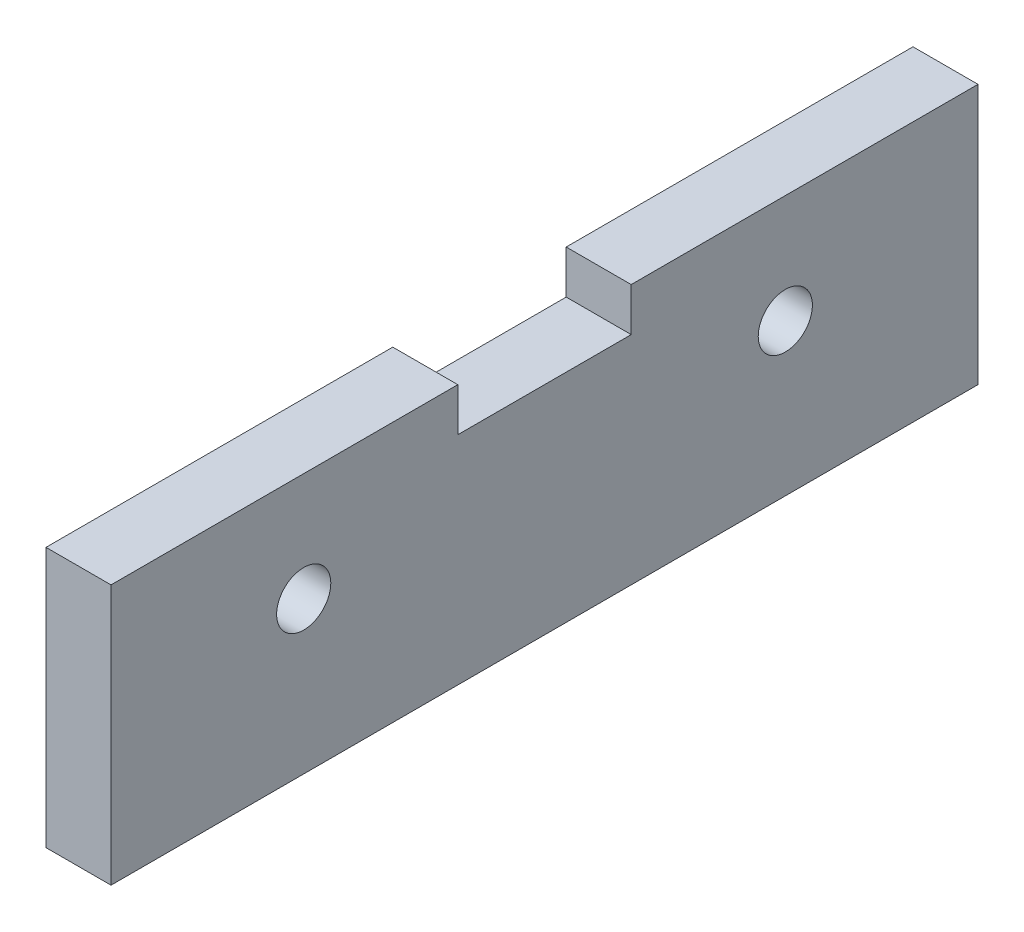
ISO-10303-21;
HEADER;
FILE_DESCRIPTION(('STEP AP214'),'2;1');
FILE_NAME('part.step','',(''),(''),'','','');
FILE_SCHEMA(('AUTOMOTIVE_DESIGN { 1 0 10303 214 1 1 1 1 }'));
ENDSEC;
DATA;
#1=APPLICATION_CONTEXT('core data for automotive mechanical design processes');
#2=APPLICATION_PROTOCOL_DEFINITION('international standard','automotive_design',2000,#1);
#3=PRODUCT_CONTEXT('',#1,'mechanical');
#4=PRODUCT('Part','Part','',(#3));
#5=PRODUCT_RELATED_PRODUCT_CATEGORY('part','',(#4));
#6=PRODUCT_DEFINITION_FORMATION('','',#4);
#7=PRODUCT_DEFINITION_CONTEXT('part definition',#1,'design');
#8=PRODUCT_DEFINITION('design','',#6,#7);
#9=PRODUCT_DEFINITION_SHAPE('','',#8);
#10=(LENGTH_UNIT() NAMED_UNIT(*) SI_UNIT(.MILLI.,.METRE.));
#11=(NAMED_UNIT(*) PLANE_ANGLE_UNIT() SI_UNIT($,.RADIAN.));
#12=(NAMED_UNIT(*) SI_UNIT($,.STERADIAN.) SOLID_ANGLE_UNIT());
#13=UNCERTAINTY_MEASURE_WITH_UNIT(LENGTH_MEASURE(1.E-05),#10,'distance_accuracy_value','');
#14=(GEOMETRIC_REPRESENTATION_CONTEXT(3) GLOBAL_UNCERTAINTY_ASSIGNED_CONTEXT((#13)) GLOBAL_UNIT_ASSIGNED_CONTEXT((#10,
#11,#12)) REPRESENTATION_CONTEXT('',''));
#15=CARTESIAN_POINT('',(0.,0.,0.));
#16=DIRECTION('',(0.,0.,1.));
#17=DIRECTION('',(1.,0.,0.));
#18=AXIS2_PLACEMENT_3D('',#15,#16,#17);
#19=CARTESIAN_POINT('',(3.,0.,0.));
#20=DIRECTION('',(1.,0.,0.));
#21=DIRECTION('',(0.,0.,-1.));
#22=AXIS2_PLACEMENT_3D('',#19,#20,#21);
#23=PLANE('',#22);
#24=DIRECTION('',(0.,-1.,0.));
#25=VECTOR('',#24,1.);
#26=CARTESIAN_POINT('',(3.,6.,4.));
#27=LINE('',#26,#25);
#28=CARTESIAN_POINT('',(3.,6.,4.));
#29=VERTEX_POINT('',#28);
#30=CARTESIAN_POINT('',(3.,4.,4.));
#31=VERTEX_POINT('',#30);
#32=EDGE_CURVE('E128',#29,#31,#27,.T.);
#33=ORIENTED_EDGE('',*,*,#32,.F.);
#34=DIRECTION('',(0.,0.,1.));
#35=VECTOR('',#34,1.);
#36=CARTESIAN_POINT('',(3.,6.,-20.));
#37=LINE('',#36,#35);
#38=CARTESIAN_POINT('',(3.,6.,20.));
#39=VERTEX_POINT('',#38);
#40=EDGE_CURVE('E66',#29,#39,#37,.T.);
#41=ORIENTED_EDGE('',*,*,#40,.T.);
#42=DIRECTION('',(0.,-1.,0.));
#43=VECTOR('',#42,1.);
#44=CARTESIAN_POINT('',(3.,-6.,20.));
#45=LINE('',#44,#43);
#46=CARTESIAN_POINT('',(3.,-6.,20.));
#47=VERTEX_POINT('',#46);
#48=EDGE_CURVE('E150',#39,#47,#45,.T.);
#49=ORIENTED_EDGE('',*,*,#48,.T.);
#50=DIRECTION('',(0.,0.,-1.));
#51=VECTOR('',#50,1.);
#52=CARTESIAN_POINT('',(3.,-6.,-20.));
#53=LINE('',#52,#51);
#54=CARTESIAN_POINT('',(3.,-6.,-20.));
#55=VERTEX_POINT('',#54);
#56=EDGE_CURVE('E96',#47,#55,#53,.T.);
#57=ORIENTED_EDGE('',*,*,#56,.T.);
#58=DIRECTION('',(0.,1.,0.));
#59=VECTOR('',#58,1.);
#60=CARTESIAN_POINT('',(3.,-6.,-20.));
#61=LINE('',#60,#59);
#62=CARTESIAN_POINT('',(3.,6.,-20.));
#63=VERTEX_POINT('',#62);
#64=EDGE_CURVE('E156',#55,#63,#61,.T.);
#65=ORIENTED_EDGE('',*,*,#64,.T.);
#66=CARTESIAN_POINT('',(3.,6.,-4.));
#67=VERTEX_POINT('',#66);
#68=EDGE_CURVE('E159',#63,#67,#37,.T.);
#69=ORIENTED_EDGE('',*,*,#68,.T.);
#70=DIRECTION('',(0.,1.,0.));
#71=VECTOR('',#70,1.);
#72=CARTESIAN_POINT('',(3.,6.,-4.));
#73=LINE('',#72,#71);
#74=CARTESIAN_POINT('',(3.,4.,-4.));
#75=VERTEX_POINT('',#74);
#76=EDGE_CURVE('E126',#75,#67,#73,.T.);
#77=ORIENTED_EDGE('',*,*,#76,.F.);
#78=DIRECTION('',(0.,0.,-1.));
#79=VECTOR('',#78,1.);
#80=CARTESIAN_POINT('',(3.,4.,4.));
#81=LINE('',#80,#79);
#82=EDGE_CURVE('E120',#31,#75,#81,.T.);
#83=ORIENTED_EDGE('',*,*,#82,.F.);
#84=EDGE_LOOP('',(#33,#41,#49,#57,#65,#69,#77,#83));
#85=FACE_BOUND('',#84,.T.);
#86=CARTESIAN_POINT('',(3.,0.999999999999997,11.11));
#87=DIRECTION('',(1.,0.,0.));
#88=DIRECTION('',(0.,0.,-1.));
#89=AXIS2_PLACEMENT_3D('',#86,#87,#88);
#90=CIRCLE('',#89,1.25);
#91=CARTESIAN_POINT('',(3.,0.999999999999997,9.86));
#92=VERTEX_POINT('',#91);
#93=EDGE_CURVE('E143',#92,#92,#90,.T.);
#94=ORIENTED_EDGE('',*,*,#93,.F.);
#95=EDGE_LOOP('',(#94));
#96=FACE_BOUND('',#95,.T.);
#97=CARTESIAN_POINT('',(3.,0.999999999999997,-11.11));
#98=DIRECTION('',(-1.,0.,0.));
#99=DIRECTION('',(0.,0.,1.));
#100=AXIS2_PLACEMENT_3D('',#97,#98,#99);
#101=CIRCLE('',#100,1.25);
#102=CARTESIAN_POINT('',(3.,0.999999999999997,-9.86));
#103=VERTEX_POINT('',#102);
#104=EDGE_CURVE('E203',#103,#103,#101,.T.);
#105=ORIENTED_EDGE('',*,*,#104,.T.);
#106=EDGE_LOOP('',(#105));
#107=FACE_BOUND('',#106,.T.);
#108=ADVANCED_FACE('F39',(#85,#96,#107),#23,.T.);
#109=CARTESIAN_POINT('',(0.,0.,0.));
#110=DIRECTION('',(1.,0.,0.));
#111=DIRECTION('',(0.,0.,-1.));
#112=AXIS2_PLACEMENT_3D('',#109,#110,#111);
#113=PLANE('',#112);
#114=CARTESIAN_POINT('',(0.,0.999999999999997,11.11));
#115=DIRECTION('',(1.,0.,0.));
#116=DIRECTION('',(0.,0.,-1.));
#117=AXIS2_PLACEMENT_3D('',#114,#115,#116);
#118=CIRCLE('',#117,1.25);
#119=CARTESIAN_POINT('',(0.,0.999999999999997,9.86));
#120=VERTEX_POINT('',#119);
#121=EDGE_CURVE('E168',#120,#120,#118,.T.);
#122=ORIENTED_EDGE('',*,*,#121,.T.);
#123=EDGE_LOOP('',(#122));
#124=FACE_BOUND('',#123,.T.);
#125=DIRECTION('',(0.,0.,1.));
#126=VECTOR('',#125,1.);
#127=CARTESIAN_POINT('',(0.,6.,-20.));
#128=LINE('',#127,#126);
#129=CARTESIAN_POINT('',(0.,6.,4.));
#130=VERTEX_POINT('',#129);
#131=CARTESIAN_POINT('',(0.,6.,20.));
#132=VERTEX_POINT('',#131);
#133=EDGE_CURVE('E88',#130,#132,#128,.T.);
#134=ORIENTED_EDGE('',*,*,#133,.F.);
#135=DIRECTION('',(0.,-1.,0.));
#136=VECTOR('',#135,1.);
#137=CARTESIAN_POINT('',(0.,0.,4.));
#138=LINE('',#137,#136);
#139=CARTESIAN_POINT('',(0.,4.,4.));
#140=VERTEX_POINT('',#139);
#141=EDGE_CURVE('E11',#130,#140,#138,.T.);
#142=ORIENTED_EDGE('',*,*,#141,.T.);
#143=DIRECTION('',(0.,0.,-1.));
#144=VECTOR('',#143,1.);
#145=CARTESIAN_POINT('',(0.,4.,0.));
#146=LINE('',#145,#144);
#147=CARTESIAN_POINT('',(0.,4.,-4.));
#148=VERTEX_POINT('',#147);
#149=EDGE_CURVE('E123',#140,#148,#146,.T.);
#150=ORIENTED_EDGE('',*,*,#149,.T.);
#151=DIRECTION('',(0.,1.,0.));
#152=VECTOR('',#151,1.);
#153=CARTESIAN_POINT('',(0.,0.,-4.));
#154=LINE('',#153,#152);
#155=CARTESIAN_POINT('',(0.,6.,-4.));
#156=VERTEX_POINT('',#155);
#157=EDGE_CURVE('E49',#148,#156,#154,.T.);
#158=ORIENTED_EDGE('',*,*,#157,.T.);
#159=CARTESIAN_POINT('',(0.,6.,-20.));
#160=VERTEX_POINT('',#159);
#161=EDGE_CURVE('E153',#160,#156,#128,.T.);
#162=ORIENTED_EDGE('',*,*,#161,.F.);
#163=DIRECTION('',(0.,1.,0.));
#164=VECTOR('',#163,1.);
#165=CARTESIAN_POINT('',(0.,-6.,-20.));
#166=LINE('',#165,#164);
#167=CARTESIAN_POINT('',(0.,-6.,-20.));
#168=VERTEX_POINT('',#167);
#169=EDGE_CURVE('E171',#168,#160,#166,.T.);
#170=ORIENTED_EDGE('',*,*,#169,.F.);
#171=DIRECTION('',(0.,0.,-1.));
#172=VECTOR('',#171,1.);
#173=CARTESIAN_POINT('',(0.,-6.,-20.));
#174=LINE('',#173,#172);
#175=CARTESIAN_POINT('',(0.,-6.,20.));
#176=VERTEX_POINT('',#175);
#177=EDGE_CURVE('E167',#176,#168,#174,.T.);
#178=ORIENTED_EDGE('',*,*,#177,.F.);
#179=DIRECTION('',(0.,-1.,0.));
#180=VECTOR('',#179,1.);
#181=CARTESIAN_POINT('',(0.,-6.,20.));
#182=LINE('',#181,#180);
#183=EDGE_CURVE('E163',#132,#176,#182,.T.);
#184=ORIENTED_EDGE('',*,*,#183,.F.);
#185=EDGE_LOOP('',(#134,#142,#150,#158,#162,#170,#178,#184));
#186=FACE_BOUND('',#185,.T.);
#187=CARTESIAN_POINT('',(0.,0.999999999999997,-11.11));
#188=DIRECTION('',(1.,0.,0.));
#189=DIRECTION('',(0.,0.,-1.));
#190=AXIS2_PLACEMENT_3D('',#187,#188,#189);
#191=CIRCLE('',#190,1.25);
#192=CARTESIAN_POINT('',(0.,0.999999999999997,-12.36));
#193=VERTEX_POINT('',#192);
#194=EDGE_CURVE('E43',#193,#193,#191,.F.);
#195=ORIENTED_EDGE('',*,*,#194,.F.);
#196=EDGE_LOOP('',(#195));
#197=FACE_BOUND('',#196,.T.);
#198=ADVANCED_FACE('F214',(#124,#186,#197),#113,.F.);
#199=CARTESIAN_POINT('',(3.,6.,-20.));
#200=DIRECTION('',(0.,-1.,0.));
#201=DIRECTION('',(0.,0.,-1.));
#202=AXIS2_PLACEMENT_3D('',#199,#200,#201);
#203=PLANE('',#202);
#204=ORIENTED_EDGE('',*,*,#40,.F.);
#205=DIRECTION('',(1.,0.,0.));
#206=VECTOR('',#205,1.);
#207=CARTESIAN_POINT('',(-2.,6.,4.));
#208=LINE('',#207,#206);
#209=EDGE_CURVE('E130',#130,#29,#208,.T.);
#210=ORIENTED_EDGE('',*,*,#209,.F.);
#211=ORIENTED_EDGE('',*,*,#133,.T.);
#212=DIRECTION('',(-1.,0.,0.));
#213=VECTOR('',#212,1.);
#214=CARTESIAN_POINT('',(3.,6.,20.));
#215=LINE('',#214,#213);
#216=EDGE_CURVE('E162',#39,#132,#215,.T.);
#217=ORIENTED_EDGE('',*,*,#216,.F.);
#218=EDGE_LOOP('',(#204,#210,#211,#217));
#219=FACE_BOUND('',#218,.T.);
#220=ADVANCED_FACE('F216',(#219),#203,.F.);
#221=CARTESIAN_POINT('',(3.,-6.,20.));
#222=DIRECTION('',(0.,0.,-1.));
#223=DIRECTION('',(-1.,0.,0.));
#224=AXIS2_PLACEMENT_3D('',#221,#222,#223);
#225=PLANE('',#224);
#226=ORIENTED_EDGE('',*,*,#183,.T.);
#227=DIRECTION('',(-1.,0.,0.));
#228=VECTOR('',#227,1.);
#229=CARTESIAN_POINT('',(3.,-6.,20.));
#230=LINE('',#229,#228);
#231=EDGE_CURVE('E187',#47,#176,#230,.T.);
#232=ORIENTED_EDGE('',*,*,#231,.F.);
#233=ORIENTED_EDGE('',*,*,#48,.F.);
#234=ORIENTED_EDGE('',*,*,#216,.T.);
#235=EDGE_LOOP('',(#226,#232,#233,#234));
#236=FACE_BOUND('',#235,.T.);
#237=ADVANCED_FACE('F41',(#236),#225,.F.);
#238=CARTESIAN_POINT('',(3.,-6.,-20.));
#239=DIRECTION('',(0.,1.,0.));
#240=DIRECTION('',(0.,0.,1.));
#241=AXIS2_PLACEMENT_3D('',#238,#239,#240);
#242=PLANE('',#241);
#243=ORIENTED_EDGE('',*,*,#177,.T.);
#244=DIRECTION('',(-1.,0.,0.));
#245=VECTOR('',#244,1.);
#246=CARTESIAN_POINT('',(3.,-6.,-20.));
#247=LINE('',#246,#245);
#248=EDGE_CURVE('E183',#55,#168,#247,.T.);
#249=ORIENTED_EDGE('',*,*,#248,.F.);
#250=ORIENTED_EDGE('',*,*,#56,.F.);
#251=ORIENTED_EDGE('',*,*,#231,.T.);
#252=EDGE_LOOP('',(#243,#249,#250,#251));
#253=FACE_BOUND('',#252,.T.);
#254=ADVANCED_FACE('F232',(#253),#242,.F.);
#255=CARTESIAN_POINT('',(3.,-6.,-20.));
#256=DIRECTION('',(0.,0.,1.));
#257=DIRECTION('',(1.,0.,0.));
#258=AXIS2_PLACEMENT_3D('',#255,#256,#257);
#259=PLANE('',#258);
#260=ORIENTED_EDGE('',*,*,#169,.T.);
#261=DIRECTION('',(-1.,0.,0.));
#262=VECTOR('',#261,1.);
#263=CARTESIAN_POINT('',(3.,6.,-20.));
#264=LINE('',#263,#262);
#265=EDGE_CURVE('E179',#63,#160,#264,.T.);
#266=ORIENTED_EDGE('',*,*,#265,.F.);
#267=ORIENTED_EDGE('',*,*,#64,.F.);
#268=ORIENTED_EDGE('',*,*,#248,.T.);
#269=EDGE_LOOP('',(#260,#266,#267,#268));
#270=FACE_BOUND('',#269,.T.);
#271=ADVANCED_FACE('F229',(#270),#259,.F.);
#272=ORIENTED_EDGE('',*,*,#161,.T.);
#273=DIRECTION('',(1.,0.,0.));
#274=VECTOR('',#273,1.);
#275=CARTESIAN_POINT('',(-2.,6.,-4.));
#276=LINE('',#275,#274);
#277=EDGE_CURVE('E144',#156,#67,#276,.T.);
#278=ORIENTED_EDGE('',*,*,#277,.T.);
#279=ORIENTED_EDGE('',*,*,#68,.F.);
#280=ORIENTED_EDGE('',*,*,#265,.T.);
#281=EDGE_LOOP('',(#272,#278,#279,#280));
#282=FACE_BOUND('',#281,.T.);
#283=ADVANCED_FACE('F223',(#282),#203,.F.);
#284=CARTESIAN_POINT('',(-2.,6.,4.));
#285=DIRECTION('',(0.,0.,1.));
#286=DIRECTION('',(1.,0.,0.));
#287=AXIS2_PLACEMENT_3D('',#284,#285,#286);
#288=PLANE('',#287);
#289=ORIENTED_EDGE('',*,*,#209,.T.);
#290=ORIENTED_EDGE('',*,*,#32,.T.);
#291=DIRECTION('',(1.,0.,0.));
#292=VECTOR('',#291,1.);
#293=CARTESIAN_POINT('',(-2.,4.,4.));
#294=LINE('',#293,#292);
#295=EDGE_CURVE('E116',#140,#31,#294,.T.);
#296=ORIENTED_EDGE('',*,*,#295,.F.);
#297=ORIENTED_EDGE('',*,*,#141,.F.);
#298=EDGE_LOOP('',(#289,#290,#296,#297));
#299=FACE_BOUND('',#298,.T.);
#300=ADVANCED_FACE('F129',(#299),#288,.F.);
#301=CARTESIAN_POINT('',(-2.,6.,-4.));
#302=DIRECTION('',(0.,0.,-1.));
#303=DIRECTION('',(-1.,0.,0.));
#304=AXIS2_PLACEMENT_3D('',#301,#302,#303);
#305=PLANE('',#304);
#306=DIRECTION('',(1.,0.,0.));
#307=VECTOR('',#306,1.);
#308=CARTESIAN_POINT('',(-2.,4.,-4.));
#309=LINE('',#308,#307);
#310=EDGE_CURVE('E57',#148,#75,#309,.T.);
#311=ORIENTED_EDGE('',*,*,#310,.T.);
#312=ORIENTED_EDGE('',*,*,#76,.T.);
#313=ORIENTED_EDGE('',*,*,#277,.F.);
#314=ORIENTED_EDGE('',*,*,#157,.F.);
#315=EDGE_LOOP('',(#311,#312,#313,#314));
#316=FACE_BOUND('',#315,.T.);
#317=ADVANCED_FACE('F250',(#316),#305,.F.);
#318=CARTESIAN_POINT('',(-2.,4.,4.));
#319=DIRECTION('',(0.,-1.,0.));
#320=DIRECTION('',(0.,0.,-1.));
#321=AXIS2_PLACEMENT_3D('',#318,#319,#320);
#322=PLANE('',#321);
#323=ORIENTED_EDGE('',*,*,#295,.T.);
#324=ORIENTED_EDGE('',*,*,#82,.T.);
#325=ORIENTED_EDGE('',*,*,#310,.F.);
#326=ORIENTED_EDGE('',*,*,#149,.F.);
#327=EDGE_LOOP('',(#323,#324,#325,#326));
#328=FACE_BOUND('',#327,.T.);
#329=ADVANCED_FACE('F118',(#328),#322,.F.);
#330=CARTESIAN_POINT('',(-2.,0.999999999999997,11.11));
#331=DIRECTION('',(1.,0.,0.));
#332=DIRECTION('',(0.,0.,-1.));
#333=AXIS2_PLACEMENT_3D('',#330,#331,#332);
#334=CYLINDRICAL_SURFACE('',#333,1.25);
#335=ORIENTED_EDGE('',*,*,#93,.T.);
#336=EDGE_LOOP('',(#335));
#337=FACE_BOUND('',#336,.T.);
#338=ORIENTED_EDGE('',*,*,#121,.F.);
#339=EDGE_LOOP('',(#338));
#340=FACE_BOUND('',#339,.T.);
#341=ADVANCED_FACE('F257',(#337,#340),#334,.F.);
#342=CARTESIAN_POINT('',(-2.,0.999999999999997,-11.11));
#343=DIRECTION('',(1.,0.,0.));
#344=DIRECTION('',(0.,0.,-1.));
#345=AXIS2_PLACEMENT_3D('',#342,#343,#344);
#346=CYLINDRICAL_SURFACE('',#345,1.25);
#347=ORIENTED_EDGE('',*,*,#104,.F.);
#348=EDGE_LOOP('',(#347));
#349=FACE_BOUND('',#348,.T.);
#350=ORIENTED_EDGE('',*,*,#194,.T.);
#351=EDGE_LOOP('',(#350));
#352=FACE_BOUND('',#351,.T.);
#353=ADVANCED_FACE('F212',(#349,#352),#346,.F.);
#354=CLOSED_SHELL('',(#108,#198,#220,#237,#254,#271,#283,#300,#317,#329,#341,#353));
#355=MANIFOLD_SOLID_BREP('B2',#354);
#356=ADVANCED_BREP_SHAPE_REPRESENTATION('',(#18,#355),#14);
#357=SHAPE_DEFINITION_REPRESENTATION(#9,#356);
ENDSEC;
END-ISO-10303-21;
